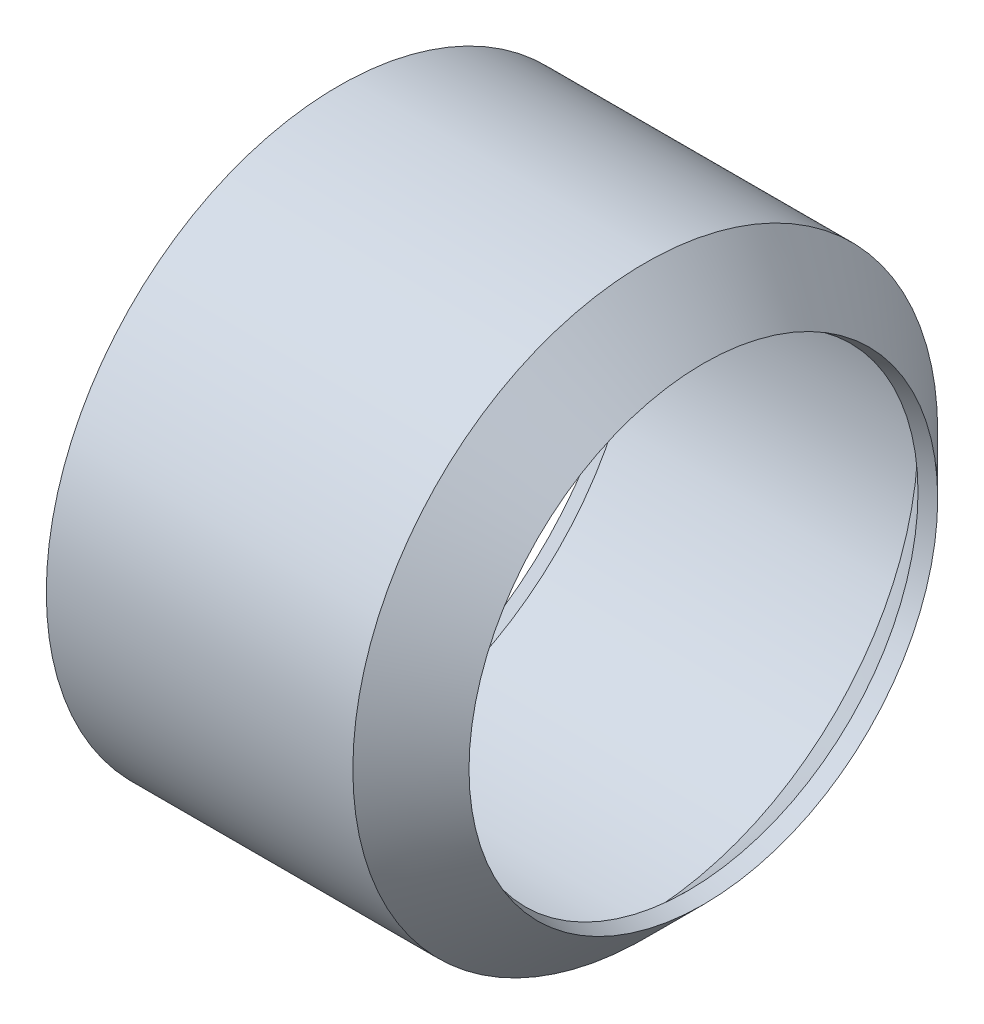
ISO-10303-21;
HEADER;
FILE_DESCRIPTION(('STEP AP214'),'2;1');
FILE_NAME('part.step','',(''),(''),'','','');
FILE_SCHEMA(('AUTOMOTIVE_DESIGN { 1 0 10303 214 1 1 1 1 }'));
ENDSEC;
DATA;
#1=APPLICATION_CONTEXT('core data for automotive mechanical design processes');
#2=APPLICATION_PROTOCOL_DEFINITION('international standard','automotive_design',2000,#1);
#3=PRODUCT_CONTEXT('',#1,'mechanical');
#4=PRODUCT('Part','Part','',(#3));
#5=PRODUCT_RELATED_PRODUCT_CATEGORY('part','',(#4));
#6=PRODUCT_DEFINITION_FORMATION('','',#4);
#7=PRODUCT_DEFINITION_CONTEXT('part definition',#1,'design');
#8=PRODUCT_DEFINITION('design','',#6,#7);
#9=PRODUCT_DEFINITION_SHAPE('','',#8);
#10=(LENGTH_UNIT() NAMED_UNIT(*) SI_UNIT(.MILLI.,.METRE.));
#11=(NAMED_UNIT(*) PLANE_ANGLE_UNIT() SI_UNIT($,.RADIAN.));
#12=(NAMED_UNIT(*) SI_UNIT($,.STERADIAN.) SOLID_ANGLE_UNIT());
#13=UNCERTAINTY_MEASURE_WITH_UNIT(LENGTH_MEASURE(1.E-05),#10,'distance_accuracy_value','');
#14=(GEOMETRIC_REPRESENTATION_CONTEXT(3) GLOBAL_UNCERTAINTY_ASSIGNED_CONTEXT((#13)) GLOBAL_UNIT_ASSIGNED_CONTEXT((#10,
#11,#12)) REPRESENTATION_CONTEXT('',''));
#15=CARTESIAN_POINT('',(0.,0.,0.));
#16=DIRECTION('',(0.,0.,1.));
#17=DIRECTION('',(1.,0.,0.));
#18=AXIS2_PLACEMENT_3D('',#15,#16,#17);
#19=CARTESIAN_POINT('',(15.7660512242138,0.,0.));
#20=DIRECTION('',(-1.,0.,0.));
#21=DIRECTION('',(0.,0.,1.));
#22=AXIS2_PLACEMENT_3D('',#19,#20,#21);
#23=CONICAL_SURFACE('',#22,26.67,0.785398163397443);
#24=CARTESIAN_POINT('',(21.0629966102543,0.,0.));
#25=DIRECTION('',(-1.,0.,0.));
#26=DIRECTION('',(0.,0.,1.));
#27=AXIS2_PLACEMENT_3D('',#24,#25,#26);
#28=CIRCLE('',#27,21.3730546139595);
#29=CARTESIAN_POINT('',(21.0629966102543,0.,21.3730546139595));
#30=VERTEX_POINT('',#29);
#31=EDGE_CURVE('E72',#30,#30,#28,.T.);
#32=ORIENTED_EDGE('',*,*,#31,.T.);
#33=EDGE_LOOP('',(#32));
#34=FACE_BOUND('',#33,.T.);
#35=CARTESIAN_POINT('',(15.7660512242138,0.,0.));
#36=DIRECTION('',(-1.,0.,0.));
#37=DIRECTION('',(0.,0.,1.));
#38=AXIS2_PLACEMENT_3D('',#35,#36,#37);
#39=CIRCLE('',#38,26.67);
#40=CARTESIAN_POINT('',(15.7660512242138,0.,26.67));
#41=VERTEX_POINT('',#40);
#42=EDGE_CURVE('E10',#41,#41,#39,.T.);
#43=ORIENTED_EDGE('',*,*,#42,.F.);
#44=EDGE_LOOP('',(#43));
#45=FACE_BOUND('',#44,.T.);
#46=ADVANCED_FACE('F45',(#34,#45),#23,.T.);
#47=CARTESIAN_POINT('',(0.,0.,0.));
#48=DIRECTION('',(-1.,0.,0.));
#49=DIRECTION('',(0.,0.,1.));
#50=AXIS2_PLACEMENT_3D('',#47,#48,#49);
#51=CYLINDRICAL_SURFACE('',#50,26.67);
#52=ORIENTED_EDGE('',*,*,#42,.T.);
#53=EDGE_LOOP('',(#52));
#54=FACE_BOUND('',#53,.T.);
#55=CARTESIAN_POINT('',(-12.192,0.,0.));
#56=DIRECTION('',(-1.,0.,0.));
#57=DIRECTION('',(0.,0.,1.));
#58=AXIS2_PLACEMENT_3D('',#55,#56,#57);
#59=CIRCLE('',#58,26.67);
#60=CARTESIAN_POINT('',(-12.192,0.,26.67));
#61=VERTEX_POINT('',#60);
#62=EDGE_CURVE('E52',#61,#61,#59,.T.);
#63=ORIENTED_EDGE('',*,*,#62,.F.);
#64=EDGE_LOOP('',(#63));
#65=FACE_BOUND('',#64,.T.);
#66=ADVANCED_FACE('F97',(#54,#65),#51,.T.);
#67=CARTESIAN_POINT('',(-10.16,0.,0.));
#68=DIRECTION('',(-1.,0.,0.));
#69=DIRECTION('',(0.,0.,1.));
#70=AXIS2_PLACEMENT_3D('',#67,#68,#69);
#71=CONICAL_SURFACE('',#70,25.4,0.558599315343563);
#72=ORIENTED_EDGE('',*,*,#62,.T.);
#73=EDGE_LOOP('',(#72));
#74=FACE_BOUND('',#73,.T.);
#75=CARTESIAN_POINT('',(-10.16,0.,0.));
#76=DIRECTION('',(-1.,0.,0.));
#77=DIRECTION('',(0.,0.,1.));
#78=AXIS2_PLACEMENT_3D('',#75,#76,#77);
#79=CIRCLE('',#78,25.4);
#80=CARTESIAN_POINT('',(-10.16,0.,25.4));
#81=VERTEX_POINT('',#80);
#82=EDGE_CURVE('E57',#81,#81,#79,.T.);
#83=ORIENTED_EDGE('',*,*,#82,.F.);
#84=EDGE_LOOP('',(#83));
#85=FACE_BOUND('',#84,.T.);
#86=ADVANCED_FACE('F93',(#74,#85),#71,.F.);
#87=CARTESIAN_POINT('',(0.,0.,0.));
#88=DIRECTION('',(-1.,0.,0.));
#89=DIRECTION('',(0.,0.,1.));
#90=AXIS2_PLACEMENT_3D('',#87,#88,#89);
#91=CYLINDRICAL_SURFACE('',#90,25.4);
#92=CARTESIAN_POINT('',(15.24,0.,0.));
#93=DIRECTION('',(-1.,0.,0.));
#94=DIRECTION('',(0.,0.,1.));
#95=AXIS2_PLACEMENT_3D('',#92,#93,#94);
#96=CIRCLE('',#95,25.4);
#97=CARTESIAN_POINT('',(15.24,0.,25.4));
#98=VERTEX_POINT('',#97);
#99=EDGE_CURVE('E62',#98,#98,#96,.T.);
#100=ORIENTED_EDGE('',*,*,#99,.F.);
#101=EDGE_LOOP('',(#100));
#102=FACE_BOUND('',#101,.T.);
#103=ORIENTED_EDGE('',*,*,#82,.T.);
#104=EDGE_LOOP('',(#103));
#105=FACE_BOUND('',#104,.T.);
#106=ADVANCED_FACE('F87',(#102,#105),#91,.F.);
#107=CARTESIAN_POINT('',(19.6573913043479,0.,0.));
#108=DIRECTION('',(-1.,0.,0.));
#109=DIRECTION('',(0.,0.,1.));
#110=AXIS2_PLACEMENT_3D('',#107,#108,#109);
#111=CONICAL_SURFACE('',#110,20.9826086956522,0.785398163397442);
#112=ORIENTED_EDGE('',*,*,#99,.T.);
#113=EDGE_LOOP('',(#112));
#114=FACE_BOUND('',#113,.T.);
#115=CARTESIAN_POINT('',(19.6573913043479,0.,0.));
#116=DIRECTION('',(-1.,0.,0.));
#117=DIRECTION('',(0.,0.,1.));
#118=AXIS2_PLACEMENT_3D('',#115,#116,#117);
#119=CIRCLE('',#118,20.9826086956522);
#120=CARTESIAN_POINT('',(19.6573913043479,0.,20.9826086956522));
#121=VERTEX_POINT('',#120);
#122=EDGE_CURVE('E68',#121,#121,#119,.T.);
#123=ORIENTED_EDGE('',*,*,#122,.F.);
#124=EDGE_LOOP('',(#123));
#125=FACE_BOUND('',#124,.T.);
#126=ADVANCED_FACE('F82',(#114,#125),#111,.F.);
#127=CARTESIAN_POINT('',(19.6573913043479,0.,0.));
#128=DIRECTION('',(1.,0.,0.));
#129=DIRECTION('',(0.,0.,-1.));
#130=AXIS2_PLACEMENT_3D('',#127,#128,#129);
#131=CONICAL_SURFACE('',#130,20.9826086956522,0.27094685033842);
#132=ORIENTED_EDGE('',*,*,#31,.F.);
#133=EDGE_LOOP('',(#132));
#134=FACE_BOUND('',#133,.T.);
#135=ORIENTED_EDGE('',*,*,#122,.T.);
#136=EDGE_LOOP('',(#135));
#137=FACE_BOUND('',#136,.T.);
#138=ADVANCED_FACE('F79',(#134,#137),#131,.F.);
#139=CLOSED_SHELL('',(#46,#66,#86,#106,#126,#138));
#140=MANIFOLD_SOLID_BREP('B2',#139);
#141=ADVANCED_BREP_SHAPE_REPRESENTATION('',(#18,#140),#14);
#142=SHAPE_DEFINITION_REPRESENTATION(#9,#141);
ENDSEC;
END-ISO-10303-21;
